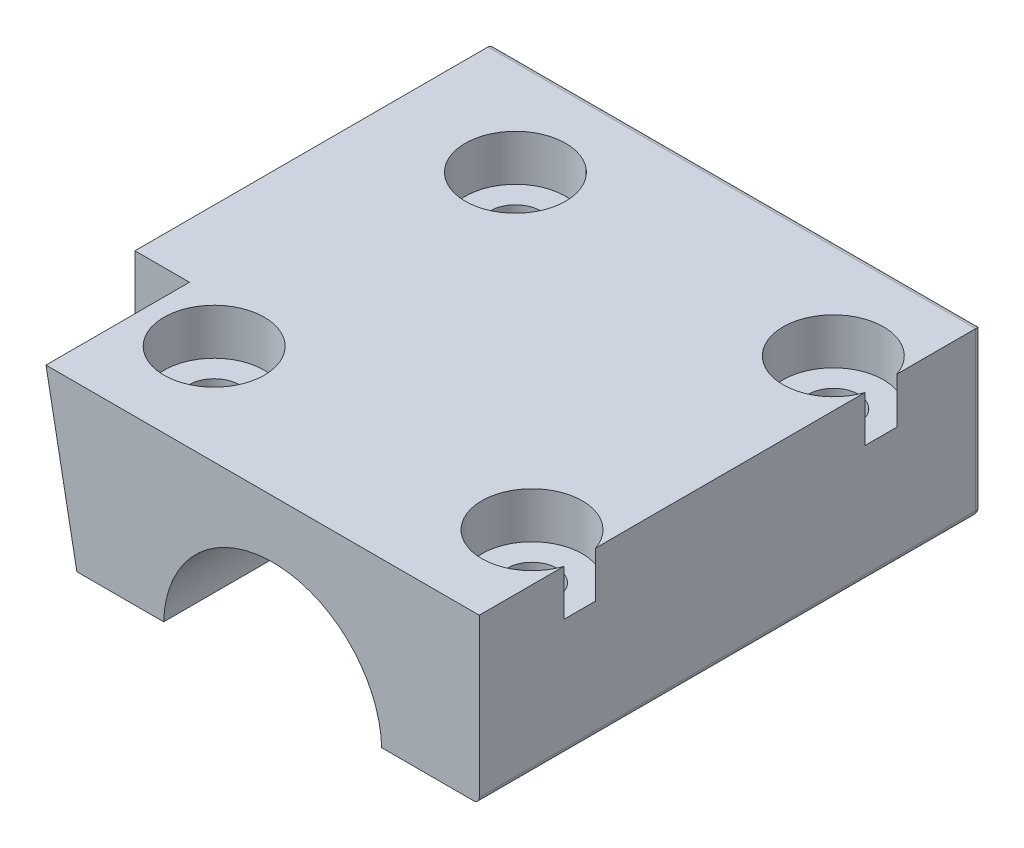
ISO-10303-21;
HEADER;
FILE_DESCRIPTION(('STEP AP214'),'2;1');
FILE_NAME('part.step','',(''),(''),'','','');
FILE_SCHEMA(('AUTOMOTIVE_DESIGN { 1 0 10303 214 1 1 1 1 }'));
ENDSEC;
DATA;
#1=APPLICATION_CONTEXT('core data for automotive mechanical design processes');
#2=APPLICATION_PROTOCOL_DEFINITION('international standard','automotive_design',2000,#1);
#3=PRODUCT_CONTEXT('',#1,'mechanical');
#4=PRODUCT('Part','Part','',(#3));
#5=PRODUCT_RELATED_PRODUCT_CATEGORY('part','',(#4));
#6=PRODUCT_DEFINITION_FORMATION('','',#4);
#7=PRODUCT_DEFINITION_CONTEXT('part definition',#1,'design');
#8=PRODUCT_DEFINITION('design','',#6,#7);
#9=PRODUCT_DEFINITION_SHAPE('','',#8);
#10=(LENGTH_UNIT() NAMED_UNIT(*) SI_UNIT(.MILLI.,.METRE.));
#11=(NAMED_UNIT(*) PLANE_ANGLE_UNIT() SI_UNIT($,.RADIAN.));
#12=(NAMED_UNIT(*) SI_UNIT($,.STERADIAN.) SOLID_ANGLE_UNIT());
#13=UNCERTAINTY_MEASURE_WITH_UNIT(LENGTH_MEASURE(1.E-05),#10,'distance_accuracy_value','');
#14=(GEOMETRIC_REPRESENTATION_CONTEXT(3) GLOBAL_UNCERTAINTY_ASSIGNED_CONTEXT((#13)) GLOBAL_UNIT_ASSIGNED_CONTEXT((#10,
#11,#12)) REPRESENTATION_CONTEXT('',''));
#15=CARTESIAN_POINT('',(0.,0.,0.));
#16=DIRECTION('',(0.,0.,1.));
#17=DIRECTION('',(1.,0.,0.));
#18=AXIS2_PLACEMENT_3D('',#15,#16,#17);
#19=CARTESIAN_POINT('',(82.6500040000003,-20.05,-34.9999999999992));
#20=DIRECTION('',(0.,1.,0.));
#21=DIRECTION('',(1.,0.,0.));
#22=AXIS2_PLACEMENT_3D('',#19,#20,#21);
#23=PLANE('',#22);
#24=CARTESIAN_POINT('',(91.1714091434301,-20.05,-41.9999999999988));
#25=DIRECTION('',(0.,-1.,0.));
#26=DIRECTION('',(-1.,0.,0.));
#27=AXIS2_PLACEMENT_3D('',#24,#25,#26);
#28=CIRCLE('',#27,3.5);
#29=CARTESIAN_POINT('',(94.67140914343,-20.0499999999997,-41.9999999999986));
#30=VERTEX_POINT('',#29);
#31=EDGE_CURVE('E21',#30,#30,#28,.T.);
#32=ORIENTED_EDGE('',*,*,#31,.T.);
#33=EDGE_LOOP('',(#32));
#34=FACE_BOUND('',#33,.T.);
#35=CARTESIAN_POINT('',(91.1714091434314,-20.05,-62.9999999999991));
#36=DIRECTION('',(0.,-1.,0.));
#37=DIRECTION('',(-1.,0.,0.));
#38=AXIS2_PLACEMENT_3D('',#35,#36,#37);
#39=CIRCLE('',#38,3.5);
#40=CARTESIAN_POINT('',(94.6714091434314,-20.0499999999997,-62.9999999999989));
#41=VERTEX_POINT('',#40);
#42=EDGE_CURVE('E370',#41,#41,#39,.T.);
#43=ORIENTED_EDGE('',*,*,#42,.T.);
#44=EDGE_LOOP('',(#43));
#45=FACE_BOUND('',#44,.T.);
#46=DIRECTION('',(0.,0.,1.));
#47=VECTOR('',#46,1.);
#48=CARTESIAN_POINT('',(86.4500040000002,-20.05,-34.999999999999));
#49=LINE('',#48,#47);
#50=CARTESIAN_POINT('',(86.4500040000001,-20.05,-44.9999999999987));
#51=VERTEX_POINT('',#50);
#52=CARTESIAN_POINT('',(86.4500040000002,-20.05,-34.9999999999987));
#53=VERTEX_POINT('',#52);
#54=EDGE_CURVE('E312',#51,#53,#49,.T.);
#55=ORIENTED_EDGE('',*,*,#54,.T.);
#56=DIRECTION('',(-1.,0.,0.));
#57=VECTOR('',#56,1.);
#58=CARTESIAN_POINT('',(116.65,-20.05,-34.9999999999995));
#59=LINE('',#58,#57);
#60=CARTESIAN_POINT('',(116.65,-20.05,-34.9999999999995));
#61=VERTEX_POINT('',#60);
#62=EDGE_CURVE('E348',#61,#53,#59,.T.);
#63=ORIENTED_EDGE('',*,*,#62,.F.);
#64=DIRECTION('',(0.,0.,-1.));
#65=VECTOR('',#64,1.);
#66=CARTESIAN_POINT('',(116.65,-20.05,-34.9999999999995));
#67=LINE('',#66,#65);
#68=CARTESIAN_POINT('',(116.65,-20.0499999999997,-40.8962362370529));
#69=VERTEX_POINT('',#68);
#70=EDGE_CURVE('E257',#61,#69,#67,.T.);
#71=ORIENTED_EDGE('',*,*,#70,.T.);
#72=CARTESIAN_POINT('',(113.328598856566,-20.05,-42.0000000000011));
#73=DIRECTION('',(0.,-1.,0.));
#74=DIRECTION('',(-1.,0.,0.));
#75=AXIS2_PLACEMENT_3D('',#72,#73,#74);
#76=CIRCLE('',#75,3.5);
#77=CARTESIAN_POINT('',(116.65,-20.0499999999997,-43.1037637629495));
#78=VERTEX_POINT('',#77);
#79=EDGE_CURVE('E208',#69,#78,#76,.T.);
#80=ORIENTED_EDGE('',*,*,#79,.T.);
#81=DIRECTION('',(0.,0.,-1.));
#82=VECTOR('',#81,1.);
#83=CARTESIAN_POINT('',(116.65,-20.05,-34.9999999999995));
#84=LINE('',#83,#82);
#85=CARTESIAN_POINT('',(116.65,-20.0499999999997,-61.896236237051));
#86=VERTEX_POINT('',#85);
#87=EDGE_CURVE('E380',#78,#86,#84,.T.);
#88=ORIENTED_EDGE('',*,*,#87,.T.);
#89=CARTESIAN_POINT('',(113.328598856566,-20.05,-63.));
#90=DIRECTION('',(0.,-1.,0.));
#91=DIRECTION('',(-1.,0.,0.));
#92=AXIS2_PLACEMENT_3D('',#89,#90,#91);
#93=CIRCLE('',#92,3.5);
#94=CARTESIAN_POINT('',(116.65,-20.0499999999997,-64.1037637629477));
#95=VERTEX_POINT('',#94);
#96=EDGE_CURVE('E219',#86,#95,#93,.T.);
#97=ORIENTED_EDGE('',*,*,#96,.T.);
#98=DIRECTION('',(0.,0.,-1.));
#99=VECTOR('',#98,1.);
#100=CARTESIAN_POINT('',(116.65,-20.05,-34.9999999999995));
#101=LINE('',#100,#99);
#102=CARTESIAN_POINT('',(116.65,-20.05,-69.6));
#103=VERTEX_POINT('',#102);
#104=EDGE_CURVE('E267',#95,#103,#101,.T.);
#105=ORIENTED_EDGE('',*,*,#104,.T.);
#106=DIRECTION('',(1.,0.,0.));
#107=VECTOR('',#106,1.);
#108=CARTESIAN_POINT('',(91.1500029999999,-20.05,-69.6));
#109=LINE('',#108,#107);
#110=CARTESIAN_POINT('',(82.650004,-20.05,-69.6));
#111=VERTEX_POINT('',#110);
#112=EDGE_CURVE('E280',#111,#103,#109,.T.);
#113=ORIENTED_EDGE('',*,*,#112,.F.);
#114=DIRECTION('',(0.,0.,-1.));
#115=VECTOR('',#114,1.);
#116=CARTESIAN_POINT('',(82.6500040000003,-20.05,-34.9999999999992));
#117=LINE('',#116,#115);
#118=CARTESIAN_POINT('',(82.6500040000001,-20.05,-44.9999999999987));
#119=VERTEX_POINT('',#118);
#120=EDGE_CURVE('E11',#119,#111,#117,.T.);
#121=ORIENTED_EDGE('',*,*,#120,.F.);
#122=DIRECTION('',(1.,0.,0.));
#123=VECTOR('',#122,1.);
#124=CARTESIAN_POINT('',(91.1500030000001,-20.05,-44.9999999903469));
#125=LINE('',#124,#123);
#126=EDGE_CURVE('E315',#119,#51,#125,.T.);
#127=ORIENTED_EDGE('',*,*,#126,.T.);
#128=EDGE_LOOP('',(#55,#63,#71,#80,#88,#97,#105,#113,#121,#127));
#129=FACE_BOUND('',#128,.T.);
#130=ADVANCED_FACE('F17',(#34,#45,#129),#23,.T.);
#131=CARTESIAN_POINT('',(82.6500040000003,-31.6499999999994,-34.9999999999993));
#132=DIRECTION('',(-1.,0.,0.));
#133=DIRECTION('',(0.,1.,0.));
#134=AXIS2_PLACEMENT_3D('',#131,#132,#133);
#135=PLANE('',#134);
#136=DIRECTION('',(0.,1.,0.));
#137=VECTOR('',#136,1.);
#138=CARTESIAN_POINT('',(82.6500040000002,-28.6999999999995,-44.9999999903468));
#139=LINE('',#138,#137);
#140=CARTESIAN_POINT('',(82.6500040000001,-31.0499999999994,-44.9999999999987));
#141=VERTEX_POINT('',#140);
#142=EDGE_CURVE('E273',#141,#119,#139,.T.);
#143=ORIENTED_EDGE('',*,*,#142,.T.);
#144=ORIENTED_EDGE('',*,*,#120,.T.);
#145=DIRECTION('',(0.,1.,0.));
#146=VECTOR('',#145,1.);
#147=CARTESIAN_POINT('',(82.650004,-28.7499999999995,-69.6));
#148=LINE('',#147,#146);
#149=CARTESIAN_POINT('',(82.650004,-31.0499999999994,-69.6));
#150=VERTEX_POINT('',#149);
#151=EDGE_CURVE('E28',#150,#111,#148,.T.);
#152=ORIENTED_EDGE('',*,*,#151,.F.);
#153=DIRECTION('',(0.,0.,-1.));
#154=VECTOR('',#153,1.);
#155=CARTESIAN_POINT('',(82.6500040000003,-31.0499999999994,-34.9999999999993));
#156=LINE('',#155,#154);
#157=EDGE_CURVE('E335',#141,#150,#156,.T.);
#158=ORIENTED_EDGE('',*,*,#157,.F.);
#159=EDGE_LOOP('',(#143,#144,#152,#158));
#160=FACE_BOUND('',#159,.T.);
#161=ADVANCED_FACE('F1078',(#160),#135,.T.);
#162=CARTESIAN_POINT('',(102.250003999999,-31.6499999999994,-34.9999999999994));
#163=DIRECTION('',(0.,0.,-1.));
#164=DIRECTION('',(-1.,0.,0.));
#165=AXIS2_PLACEMENT_3D('',#162,#163,#164);
#166=CYLINDRICAL_SURFACE('',#165,7.6);
#167=CARTESIAN_POINT('',(102.250003999998,-31.6499999999994,-69.6));
#168=DIRECTION('',(0.,0.,1.));
#169=DIRECTION('',(0.,1.,0.));
#170=AXIS2_PLACEMENT_3D('',#167,#168,#169);
#171=CIRCLE('',#170,7.6);
#172=CARTESIAN_POINT('',(109.847371965287,-31.4499999999994,-69.6));
#173=VERTEX_POINT('',#172);
#174=CARTESIAN_POINT('',(94.6526360347093,-31.4499999999994,-69.6));
#175=VERTEX_POINT('',#174);
#176=EDGE_CURVE('E361',#173,#175,#171,.T.);
#177=ORIENTED_EDGE('',*,*,#176,.F.);
#178=DIRECTION('',(0.,0.,1.));
#179=VECTOR('',#178,1.);
#180=CARTESIAN_POINT('',(109.847371965288,-31.4499999999994,-34.9999999999994));
#181=LINE('',#180,#179);
#182=CARTESIAN_POINT('',(109.847371965288,-31.4499999999994,-34.9999999999995));
#183=VERTEX_POINT('',#182);
#184=EDGE_CURVE('E300',#173,#183,#181,.T.);
#185=ORIENTED_EDGE('',*,*,#184,.T.);
#186=CARTESIAN_POINT('',(102.250003999999,-31.6499999999994,-34.9999999999994));
#187=DIRECTION('',(0.,0.,1.));
#188=DIRECTION('',(-1.,0.,0.));
#189=AXIS2_PLACEMENT_3D('',#186,#187,#188);
#190=CIRCLE('',#189,7.6);
#191=CARTESIAN_POINT('',(94.6526360347096,-31.4499999999994,-34.9999999999993));
#192=VERTEX_POINT('',#191);
#193=EDGE_CURVE('E225',#183,#192,#190,.T.);
#194=ORIENTED_EDGE('',*,*,#193,.T.);
#195=DIRECTION('',(0.,0.,-1.));
#196=VECTOR('',#195,1.);
#197=CARTESIAN_POINT('',(94.6526360347096,-31.4499999999994,-34.9999999999994));
#198=LINE('',#197,#196);
#199=EDGE_CURVE('E246',#192,#175,#198,.T.);
#200=ORIENTED_EDGE('',*,*,#199,.T.);
#201=EDGE_LOOP('',(#177,#185,#194,#200));
#202=FACE_BOUND('',#201,.T.);
#203=ADVANCED_FACE('F560',(#202),#166,.F.);
#204=CARTESIAN_POINT('',(83.050004,-28.7499999999995,-69.6));
#205=DIRECTION('',(0.,-1.,0.));
#206=DIRECTION('',(-0.707106781186579,0.,-0.707106781186516));
#207=AXIS2_PLACEMENT_3D('',#204,#205,#206);
#208=CYLINDRICAL_SURFACE('',#207,0.4);
#209=CARTESIAN_POINT('',(83.050004,-31.0499999999994,-69.6));
#210=DIRECTION('',(0.,-1.,0.));
#211=DIRECTION('',(-0.707106781186581,0.,-0.707106781186514));
#212=AXIS2_PLACEMENT_3D('',#209,#210,#211);
#213=CIRCLE('',#212,0.399999999999995);
#214=CARTESIAN_POINT('',(83.050004,-31.0499999999994,-70.));
#215=VERTEX_POINT('',#214);
#216=EDGE_CURVE('E226',#150,#215,#213,.T.);
#217=ORIENTED_EDGE('',*,*,#216,.F.);
#218=ORIENTED_EDGE('',*,*,#151,.T.);
#219=CARTESIAN_POINT('',(83.050004,-20.45,-69.6));
#220=DIRECTION('',(0.70710678118654,0.707106781186555,0.));
#221=DIRECTION('',(0.707106781186555,-0.70710678118654,0.));
#222=AXIS2_PLACEMENT_3D('',#219,#220,#221);
#223=ELLIPSE('',#222,0.565685424949244,0.4);
#224=CARTESIAN_POINT('',(83.050004,-20.45,-70.));
#225=VERTEX_POINT('',#224);
#226=EDGE_CURVE('E294',#225,#111,#223,.T.);
#227=ORIENTED_EDGE('',*,*,#226,.F.);
#228=DIRECTION('',(0.,-1.,0.));
#229=VECTOR('',#228,1.);
#230=CARTESIAN_POINT('',(83.050004,-28.7499999999995,-70.));
#231=LINE('',#230,#229);
#232=EDGE_CURVE('E295',#225,#215,#231,.T.);
#233=ORIENTED_EDGE('',*,*,#232,.T.);
#234=EDGE_LOOP('',(#217,#218,#227,#233));
#235=FACE_BOUND('',#234,.T.);
#236=ADVANCED_FACE('F1060',(#235),#208,.T.);
#237=CARTESIAN_POINT('',(91.1500029999999,-20.45,-69.6));
#238=DIRECTION('',(-1.,0.,0.));
#239=DIRECTION('',(0.,0.707106781186555,-0.70710678118654));
#240=AXIS2_PLACEMENT_3D('',#237,#238,#239);
#241=CYLINDRICAL_SURFACE('',#240,0.4);
#242=DIRECTION('',(-1.,0.,0.));
#243=VECTOR('',#242,1.);
#244=CARTESIAN_POINT('',(91.1500029999999,-20.45,-70.));
#245=LINE('',#244,#243);
#246=CARTESIAN_POINT('',(116.25,-20.45,-70.));
#247=VERTEX_POINT('',#246);
#248=EDGE_CURVE('E291',#247,#225,#245,.T.);
#249=ORIENTED_EDGE('',*,*,#248,.T.);
#250=ORIENTED_EDGE('',*,*,#226,.T.);
#251=ORIENTED_EDGE('',*,*,#112,.T.);
#252=CARTESIAN_POINT('',(116.25,-20.45,-69.6));
#253=DIRECTION('',(0.707106781186571,-0.707106781186524,0.));
#254=DIRECTION('',(-0.707106781186524,-0.707106781186571,0.));
#255=AXIS2_PLACEMENT_3D('',#252,#253,#254);
#256=ELLIPSE('',#255,0.565685424949257,0.4);
#257=EDGE_CURVE('E431',#247,#103,#256,.T.);
#258=ORIENTED_EDGE('',*,*,#257,.F.);
#259=EDGE_LOOP('',(#249,#250,#251,#258));
#260=FACE_BOUND('',#259,.T.);
#261=ADVANCED_FACE('F573',(#260),#241,.T.);
#262=CARTESIAN_POINT('',(99.6500019999999,-25.85,-70.));
#263=DIRECTION('',(0.,0.,-1.));
#264=DIRECTION('',(-1.,0.,0.));
#265=AXIS2_PLACEMENT_3D('',#262,#263,#264);
#266=PLANE('',#265);
#267=DIRECTION('',(1.,0.,0.));
#268=VECTOR('',#267,1.);
#269=CARTESIAN_POINT('',(108.150001,-31.0499999999994,-70.));
#270=LINE('',#269,#268);
#271=CARTESIAN_POINT('',(110.22747227007,-31.0499999999994,-70.));
#272=VERTEX_POINT('',#271);
#273=CARTESIAN_POINT('',(116.25,-31.0499999999994,-70.));
#274=VERTEX_POINT('',#273);
#275=EDGE_CURVE('E248',#272,#274,#270,.T.);
#276=ORIENTED_EDGE('',*,*,#275,.F.);
#277=CARTESIAN_POINT('',(102.250003999998,-31.6499999999994,-70.));
#278=DIRECTION('',(0.,0.,-1.));
#279=DIRECTION('',(0.,1.,0.));
#280=AXIS2_PLACEMENT_3D('',#277,#278,#279);
#281=CIRCLE('',#280,8.);
#282=CARTESIAN_POINT('',(94.2725357299267,-31.0499999999994,-70.));
#283=VERTEX_POINT('',#282);
#284=EDGE_CURVE('E343',#283,#272,#281,.T.);
#285=ORIENTED_EDGE('',*,*,#284,.F.);
#286=DIRECTION('',(1.,0.,0.));
#287=VECTOR('',#286,1.);
#288=CARTESIAN_POINT('',(97.1500029999991,-31.0499999999994,-70.));
#289=LINE('',#288,#287);
#290=EDGE_CURVE('E394',#215,#283,#289,.T.);
#291=ORIENTED_EDGE('',*,*,#290,.F.);
#292=ORIENTED_EDGE('',*,*,#232,.F.);
#293=ORIENTED_EDGE('',*,*,#248,.F.);
#294=DIRECTION('',(0.,1.,0.));
#295=VECTOR('',#294,1.);
#296=CARTESIAN_POINT('',(116.25,-22.95,-70.));
#297=LINE('',#296,#295);
#298=EDGE_CURVE('E303',#274,#247,#297,.T.);
#299=ORIENTED_EDGE('',*,*,#298,.F.);
#300=EDGE_LOOP('',(#276,#285,#291,#292,#293,#299));
#301=FACE_BOUND('',#300,.T.);
#302=ADVANCED_FACE('F568',(#301),#266,.T.);
#303=CARTESIAN_POINT('',(116.25,-22.95,-69.6));
#304=DIRECTION('',(0.,1.,0.));
#305=DIRECTION('',(0.707106781186516,0.,-0.707106781186579));
#306=AXIS2_PLACEMENT_3D('',#303,#304,#305);
#307=CYLINDRICAL_SURFACE('',#306,0.4);
#308=CARTESIAN_POINT('',(116.25,-31.0499999999994,-69.6));
#309=DIRECTION('',(0.,-1.,0.));
#310=DIRECTION('',(0.707106781186525,0.,-0.70710678118657));
#311=AXIS2_PLACEMENT_3D('',#308,#309,#310);
#312=CIRCLE('',#311,0.4);
#313=CARTESIAN_POINT('',(116.65,-31.0499999999994,-69.6));
#314=VERTEX_POINT('',#313);
#315=EDGE_CURVE('E230',#274,#314,#312,.T.);
#316=ORIENTED_EDGE('',*,*,#315,.F.);
#317=ORIENTED_EDGE('',*,*,#298,.T.);
#318=ORIENTED_EDGE('',*,*,#257,.T.);
#319=DIRECTION('',(0.,-1.,0.));
#320=VECTOR('',#319,1.);
#321=CARTESIAN_POINT('',(116.65,-22.95,-69.6));
#322=LINE('',#321,#320);
#323=EDGE_CURVE('E263',#103,#314,#322,.T.);
#324=ORIENTED_EDGE('',*,*,#323,.T.);
#325=EDGE_LOOP('',(#316,#317,#318,#324));
#326=FACE_BOUND('',#325,.T.);
#327=ADVANCED_FACE('F429',(#326),#307,.T.);
#328=CARTESIAN_POINT('',(116.65,-31.4499999999994,-34.9999999999995));
#329=DIRECTION('',(0.,1.,0.));
#330=DIRECTION('',(0.,0.,-1.));
#331=AXIS2_PLACEMENT_3D('',#328,#329,#330);
#332=PLANE('',#331);
#333=CARTESIAN_POINT('',(113.328598856566,-31.4499999999994,-63.));
#334=DIRECTION('',(0.,1.,0.));
#335=DIRECTION('',(-1.,0.,0.));
#336=AXIS2_PLACEMENT_3D('',#333,#334,#335);
#337=CIRCLE('',#336,1.75);
#338=CARTESIAN_POINT('',(115.078598856566,-31.4499999999991,-62.9999999999993));
#339=VERTEX_POINT('',#338);
#340=EDGE_CURVE('E237',#339,#339,#337,.T.);
#341=ORIENTED_EDGE('',*,*,#340,.T.);
#342=EDGE_LOOP('',(#341));
#343=FACE_BOUND('',#342,.T.);
#344=CARTESIAN_POINT('',(113.328598856566,-31.4499999999994,-42.0000000000011));
#345=DIRECTION('',(0.,1.,0.));
#346=DIRECTION('',(-1.,0.,0.));
#347=AXIS2_PLACEMENT_3D('',#344,#345,#346);
#348=CIRCLE('',#347,1.75);
#349=CARTESIAN_POINT('',(115.078598856566,-31.4499999999991,-42.000000000001));
#350=VERTEX_POINT('',#349);
#351=EDGE_CURVE('E356',#350,#350,#348,.T.);
#352=ORIENTED_EDGE('',*,*,#351,.T.);
#353=EDGE_LOOP('',(#352));
#354=FACE_BOUND('',#353,.T.);
#355=DIRECTION('',(-1.,0.,0.));
#356=VECTOR('',#355,1.);
#357=CARTESIAN_POINT('',(108.150001,-31.4499999999994,-69.6));
#358=LINE('',#357,#356);
#359=CARTESIAN_POINT('',(116.25,-31.4499999999994,-69.6));
#360=VERTEX_POINT('',#359);
#361=EDGE_CURVE('E231',#360,#173,#358,.T.);
#362=ORIENTED_EDGE('',*,*,#361,.F.);
#363=DIRECTION('',(0.,0.,-1.));
#364=VECTOR('',#363,1.);
#365=CARTESIAN_POINT('',(116.25,-31.4499999999994,-34.9999999999995));
#366=LINE('',#365,#364);
#367=CARTESIAN_POINT('',(116.25,-31.4499999999994,-34.9999999903476));
#368=VERTEX_POINT('',#367);
#369=EDGE_CURVE('E240',#368,#360,#366,.T.);
#370=ORIENTED_EDGE('',*,*,#369,.F.);
#371=DIRECTION('',(1.,0.,0.));
#372=VECTOR('',#371,1.);
#373=CARTESIAN_POINT('',(108.150001,-31.4499999999994,-34.9999999903475));
#374=LINE('',#373,#372);
#375=EDGE_CURVE('E220',#183,#368,#374,.T.);
#376=ORIENTED_EDGE('',*,*,#375,.F.);
#377=ORIENTED_EDGE('',*,*,#184,.F.);
#378=EDGE_LOOP('',(#362,#370,#376,#377));
#379=FACE_BOUND('',#378,.T.);
#380=ADVANCED_FACE('F563',(#343,#354,#379),#332,.F.);
#381=CARTESIAN_POINT('',(116.25,-31.0499999999994,-69.6));
#382=DIRECTION('',(-0.40824829046386,-0.816496580927711,0.408248290463896));
#383=DIRECTION('',(0.577350269189581,-0.577350269189644,-0.577350269189653));
#384=AXIS2_PLACEMENT_3D('',#381,#382,#383);
#385=SPHERICAL_SURFACE('',#384,0.4);
#386=CARTESIAN_POINT('',(116.25,-31.0499999999994,-69.6));
#387=DIRECTION('',(-1.,0.,0.));
#388=DIRECTION('',(0.,0.,-1.));
#389=AXIS2_PLACEMENT_3D('',#386,#387,#388);
#390=CIRCLE('',#389,0.4);
#391=EDGE_CURVE('E252',#274,#360,#390,.T.);
#392=ORIENTED_EDGE('',*,*,#391,.F.);
#393=ORIENTED_EDGE('',*,*,#315,.T.);
#394=CARTESIAN_POINT('',(116.25,-31.0499999999994,-69.6));
#395=DIRECTION('',(0.,0.,1.));
#396=DIRECTION('',(0.,-1.,0.));
#397=AXIS2_PLACEMENT_3D('',#394,#395,#396);
#398=CIRCLE('',#397,0.4);
#399=EDGE_CURVE('E277',#360,#314,#398,.T.);
#400=ORIENTED_EDGE('',*,*,#399,.F.);
#401=EDGE_LOOP('',(#392,#393,#400));
#402=FACE_BOUND('',#401,.T.);
#403=ADVANCED_FACE('F415',(#402),#385,.T.);
#404=CARTESIAN_POINT('',(83.050004,-31.0499999999994,-69.6));
#405=DIRECTION('',(0.40824829046386,-0.816496580927729,0.40824829046386));
#406=DIRECTION('',(-0.577350269189629,-0.57735026918962,-0.577350269189629));
#407=AXIS2_PLACEMENT_3D('',#404,#405,#406);
#408=SPHERICAL_SURFACE('',#407,0.4);
#409=CARTESIAN_POINT('',(83.050004,-31.0499999999994,-69.6));
#410=DIRECTION('',(0.,0.,1.));
#411=DIRECTION('',(-1.,0.,0.));
#412=AXIS2_PLACEMENT_3D('',#409,#410,#411);
#413=CIRCLE('',#412,0.399999999999991);
#414=CARTESIAN_POINT('',(83.050004,-31.4499999999994,-69.6));
#415=VERTEX_POINT('',#414);
#416=EDGE_CURVE('E215',#150,#415,#413,.T.);
#417=ORIENTED_EDGE('',*,*,#416,.F.);
#418=ORIENTED_EDGE('',*,*,#216,.T.);
#419=CARTESIAN_POINT('',(83.050004,-31.0499999999994,-69.6));
#420=DIRECTION('',(1.,0.,0.));
#421=DIRECTION('',(0.,-1.,0.));
#422=AXIS2_PLACEMENT_3D('',#419,#420,#421);
#423=CIRCLE('',#422,0.4);
#424=EDGE_CURVE('E399',#415,#215,#423,.T.);
#425=ORIENTED_EDGE('',*,*,#424,.F.);
#426=EDGE_LOOP('',(#417,#418,#425));
#427=FACE_BOUND('',#426,.T.);
#428=ADVANCED_FACE('F1009',(#427),#408,.T.);
#429=CARTESIAN_POINT('',(108.150001,-31.0499999999994,-69.6));
#430=DIRECTION('',(-1.,0.,0.));
#431=DIRECTION('',(0.,-0.707106781186555,-0.70710678118654));
#432=AXIS2_PLACEMENT_3D('',#429,#430,#431);
#433=CYLINDRICAL_SURFACE('',#432,0.4);
#434=ORIENTED_EDGE('',*,*,#275,.T.);
#435=ORIENTED_EDGE('',*,*,#391,.T.);
#436=ORIENTED_EDGE('',*,*,#361,.T.);
#437=CARTESIAN_POINT('',(110.22747227007,-31.0499999999994,-70.));
#438=CARTESIAN_POINT('',(110.226601420561,-31.0509388073405,-70.));
#439=CARTESIAN_POINT('',(110.225730492149,-31.0518775460167,-69.9999966949025));
#440=CARTESIAN_POINT('',(110.186441089357,-31.0942190743765,-69.9996985821304));
#441=CARTESIAN_POINT('',(110.14769249029,-31.1356710607235,-69.9929781492694));
#442=CARTESIAN_POINT('',(110.073843441673,-31.2141114194625,-69.9670291712444));
#443=CARTESIAN_POINT('',(110.038249566349,-31.2516437189782,-69.9481223999647));
#444=CARTESIAN_POINT('',(109.970045004078,-31.3231215382995,-69.8957756063477));
#445=CARTESIAN_POINT('',(109.93729079676,-31.3571850338028,-69.8611634445186));
#446=CARTESIAN_POINT('',(109.890291432908,-31.4058389896266,-69.7866677210535));
#447=CARTESIAN_POINT('',(109.873589297114,-31.4230454103313,-69.7502666560382));
#448=CARTESIAN_POINT('',(109.852612821012,-31.4446240003891,-69.6749219872075));
#449=CARTESIAN_POINT('',(109.847371965287,-31.4499999999994,-69.6378879838991));
#450=CARTESIAN_POINT('',(109.847371965287,-31.4499999999994,-69.6));
#451=(BOUNDED_CURVE() B_SPLINE_CURVE(3,(#437,#438,#439,#440,#441,#442,#443,#444,#445,#446,#447,
#448,#449,#450),.UNSPECIFIED.,.F.,.F.) B_SPLINE_CURVE_WITH_KNOTS((4,2,2,2,2,2,4),
(-0.000384156775502614,0.,0.0169447092003417,0.0332638025637713,0.050564555527263,
0.0636348109178755,0.0751010817365113),
.UNSPECIFIED.) CURVE() GEOMETRIC_REPRESENTATION_ITEM() RATIONAL_B_SPLINE_CURVE((1.,1.,1.,1.,1.,
1.,1.,1.,1.,1.,1.,1.,1.,1.)) REPRESENTATION_ITEM(''));
#452=EDGE_CURVE('E253',#272,#173,#451,.T.);
#453=ORIENTED_EDGE('',*,*,#452,.F.);
#454=EDGE_LOOP('',(#434,#435,#436,#453));
#455=FACE_BOUND('',#454,.T.);
#456=ADVANCED_FACE('F566',(#455),#433,.T.);
#457=CARTESIAN_POINT('',(102.250003999998,-31.6499999999994,-69.6));
#458=DIRECTION('',(0.,0.,-1.));
#459=DIRECTION('',(-1.,0.,0.));
#460=AXIS2_PLACEMENT_3D('',#457,#458,#459);
#461=TOROIDAL_SURFACE('',#460,8.,0.4);
#462=ORIENTED_EDGE('',*,*,#176,.T.);
#463=CARTESIAN_POINT('',(94.2725357299267,-31.0499999999994,-70.));
#464=CARTESIAN_POINT('',(94.2734065794355,-31.0509388073405,-70.));
#465=CARTESIAN_POINT('',(94.274277507848,-31.0518775460168,-69.9999966949024));
#466=CARTESIAN_POINT('',(94.3135669106385,-31.0942190743758,-69.9996985821303));
#467=CARTESIAN_POINT('',(94.3523155097064,-31.1356710607233,-69.9929781492693));
#468=CARTESIAN_POINT('',(94.426164558324,-31.2141114194625,-69.9670291712443));
#469=CARTESIAN_POINT('',(94.4617584336482,-31.2516437189782,-69.9481223999646));
#470=CARTESIAN_POINT('',(94.5299629959184,-31.3231215382994,-69.8957756063476));
#471=CARTESIAN_POINT('',(94.5627172032367,-31.3571850338028,-69.8611634445185));
#472=CARTESIAN_POINT('',(94.6097165670887,-31.4058389896266,-69.7866677210534));
#473=CARTESIAN_POINT('',(94.6264187028825,-31.4230454103313,-69.7502666560381));
#474=CARTESIAN_POINT('',(94.6473951789847,-31.444624000389,-69.6749219872075));
#475=CARTESIAN_POINT('',(94.6526360347093,-31.4499999999994,-69.637887983899));
#476=CARTESIAN_POINT('',(94.6526360347093,-31.4499999999994,-69.6));
#477=(BOUNDED_CURVE() B_SPLINE_CURVE(3,(#463,#464,#465,#466,#467,#468,#469,#470,#471,#472,#473,
#474,#475,#476),.UNSPECIFIED.,.F.,.F.) B_SPLINE_CURVE_WITH_KNOTS((4,2,2,2,2,2,4),
(-0.0748277329214132,-0.0744469222998409,-0.0576498080630513,-0.0414728603075902,
-0.024322803586457,-0.0113663951698894,0.),
.UNSPECIFIED.) CURVE() GEOMETRIC_REPRESENTATION_ITEM() RATIONAL_B_SPLINE_CURVE((1.,1.,1.,1.,1.,
1.,1.,1.,1.,1.,1.,1.,1.,1.)) REPRESENTATION_ITEM(''));
#478=EDGE_CURVE('E398',#283,#175,#477,.T.);
#479=ORIENTED_EDGE('',*,*,#478,.F.);
#480=ORIENTED_EDGE('',*,*,#284,.T.);
#481=ORIENTED_EDGE('',*,*,#452,.T.);
#482=EDGE_LOOP('',(#462,#479,#480,#481));
#483=FACE_BOUND('',#482,.T.);
#484=ADVANCED_FACE('F989',(#483),#461,.T.);
#485=CARTESIAN_POINT('',(97.1500029999991,-31.0499999999994,-69.6));
#486=DIRECTION('',(-1.,0.,0.));
#487=DIRECTION('',(0.,-0.707106781186555,-0.70710678118654));
#488=AXIS2_PLACEMENT_3D('',#485,#486,#487);
#489=CYLINDRICAL_SURFACE('',#488,0.4);
#490=DIRECTION('',(-1.,0.,0.));
#491=VECTOR('',#490,1.);
#492=CARTESIAN_POINT('',(97.1500029999991,-31.4499999999994,-69.6));
#493=LINE('',#492,#491);
#494=EDGE_CURVE('E242',#175,#415,#493,.T.);
#495=ORIENTED_EDGE('',*,*,#494,.T.);
#496=ORIENTED_EDGE('',*,*,#424,.T.);
#497=ORIENTED_EDGE('',*,*,#290,.T.);
#498=ORIENTED_EDGE('',*,*,#478,.T.);
#499=EDGE_LOOP('',(#495,#496,#497,#498));
#500=FACE_BOUND('',#499,.T.);
#501=ADVANCED_FACE('F979',(#500),#489,.T.);
#502=CARTESIAN_POINT('',(116.25,-31.0499999999994,-34.9999999999995));
#503=DIRECTION('',(0.,0.,-1.));
#504=DIRECTION('',(0.70710678118654,-0.707106781186555,0.));
#505=AXIS2_PLACEMENT_3D('',#502,#503,#504);
#506=CYLINDRICAL_SURFACE('',#505,0.4);
#507=CARTESIAN_POINT('',(116.25,-31.0499999999994,-34.9999999903476));
#508=DIRECTION('',(0.,0.,-1.));
#509=DIRECTION('',(0.70710678118654,-0.707106781186555,0.));
#510=AXIS2_PLACEMENT_3D('',#507,#508,#509);
#511=CIRCLE('',#510,0.4);
#512=CARTESIAN_POINT('',(116.65,-31.0499999999994,-34.9999999999995));
#513=VERTEX_POINT('',#512);
#514=EDGE_CURVE('E224',#513,#368,#511,.T.);
#515=ORIENTED_EDGE('',*,*,#514,.T.);
#516=ORIENTED_EDGE('',*,*,#369,.T.);
#517=ORIENTED_EDGE('',*,*,#399,.T.);
#518=DIRECTION('',(0.,0.,1.));
#519=VECTOR('',#518,1.);
#520=CARTESIAN_POINT('',(116.65,-31.0499999999994,-34.9999999999995));
#521=LINE('',#520,#519);
#522=EDGE_CURVE('E261',#314,#513,#521,.T.);
#523=ORIENTED_EDGE('',*,*,#522,.T.);
#524=EDGE_LOOP('',(#515,#516,#517,#523));
#525=FACE_BOUND('',#524,.T.);
#526=ADVANCED_FACE('F422',(#525),#506,.T.);
#527=CARTESIAN_POINT('',(113.328598856566,-20.0499999999997,-63.));
#528=DIRECTION('',(0.,-1.,0.));
#529=DIRECTION('',(-1.,0.,0.));
#530=AXIS2_PLACEMENT_3D('',#527,#528,#529);
#531=CYLINDRICAL_SURFACE('',#530,1.75);
#532=CARTESIAN_POINT('',(113.328598856566,-23.2499953703009,-63.));
#533=DIRECTION('',(0.,1.,0.));
#534=DIRECTION('',(-1.,0.,0.));
#535=AXIS2_PLACEMENT_3D('',#532,#533,#534);
#536=CIRCLE('',#535,1.75);
#537=CARTESIAN_POINT('',(115.078598856566,-23.2499999999997,-62.9999999999993));
#538=VERTEX_POINT('',#537);
#539=EDGE_CURVE('E262',#538,#538,#536,.T.);
#540=ORIENTED_EDGE('',*,*,#539,.T.);
#541=DIRECTION('',(0.,-1.,0.));
#542=VECTOR('',#541,1.);
#543=CARTESIAN_POINT('',(115.078598856566,-20.0499999999997,-62.9999999999993));
#544=LINE('',#543,#542);
#545=EDGE_CURVE('E241',#538,#339,#544,.T.);
#546=ORIENTED_EDGE('',*,*,#545,.T.);
#547=ORIENTED_EDGE('',*,*,#340,.F.);
#548=ORIENTED_EDGE('',*,*,#545,.F.);
#549=EDGE_LOOP('',(#540,#546,#547,#548));
#550=FACE_BOUND('',#549,.T.);
#551=ADVANCED_FACE('F960',(#550),#531,.F.);
#552=CARTESIAN_POINT('',(113.328598856566,-20.0499999999997,-42.0000000000011));
#553=DIRECTION('',(0.,-1.,0.));
#554=DIRECTION('',(-1.,0.,0.));
#555=AXIS2_PLACEMENT_3D('',#552,#553,#554);
#556=CYLINDRICAL_SURFACE('',#555,1.75);
#557=CARTESIAN_POINT('',(113.328598856566,-23.2499953703009,-42.0000000000011));
#558=DIRECTION('',(0.,1.,0.));
#559=DIRECTION('',(-1.,0.,0.));
#560=AXIS2_PLACEMENT_3D('',#557,#558,#559);
#561=CIRCLE('',#560,1.75);
#562=CARTESIAN_POINT('',(115.078598856566,-23.2499999999997,-42.000000000001));
#563=VERTEX_POINT('',#562);
#564=EDGE_CURVE('E199',#563,#563,#561,.T.);
#565=ORIENTED_EDGE('',*,*,#564,.T.);
#566=DIRECTION('',(0.,-1.,0.));
#567=VECTOR('',#566,1.);
#568=CARTESIAN_POINT('',(115.078598856566,-20.0499999999997,-42.000000000001));
#569=LINE('',#568,#567);
#570=EDGE_CURVE('E352',#563,#350,#569,.T.);
#571=ORIENTED_EDGE('',*,*,#570,.T.);
#572=ORIENTED_EDGE('',*,*,#351,.F.);
#573=ORIENTED_EDGE('',*,*,#570,.F.);
#574=EDGE_LOOP('',(#565,#571,#572,#573));
#575=FACE_BOUND('',#574,.T.);
#576=ADVANCED_FACE('F948',(#575),#556,.F.);
#577=CARTESIAN_POINT('',(91.1714091434314,-20.0499999999997,-62.9999999999991));
#578=DIRECTION('',(0.,-1.,0.));
#579=DIRECTION('',(-1.,0.,0.));
#580=AXIS2_PLACEMENT_3D('',#577,#578,#579);
#581=CYLINDRICAL_SURFACE('',#580,1.75);
#582=CARTESIAN_POINT('',(91.1714091434314,-23.2499953703009,-62.9999999999991));
#583=DIRECTION('',(0.,1.,0.));
#584=DIRECTION('',(-1.,0.,0.));
#585=AXIS2_PLACEMENT_3D('',#582,#583,#584);
#586=CIRCLE('',#585,1.75);
#587=CARTESIAN_POINT('',(92.9214091434314,-23.2499999999997,-62.999999999999));
#588=VERTEX_POINT('',#587);
#589=EDGE_CURVE('E284',#588,#588,#586,.T.);
#590=ORIENTED_EDGE('',*,*,#589,.T.);
#591=DIRECTION('',(0.,-1.,0.));
#592=VECTOR('',#591,1.);
#593=CARTESIAN_POINT('',(92.9214091434314,-20.0499999999997,-62.999999999999));
#594=LINE('',#593,#592);
#595=CARTESIAN_POINT('',(92.9214091434314,-31.4499999999991,-62.999999999999));
#596=VERTEX_POINT('',#595);
#597=EDGE_CURVE('E357',#588,#596,#594,.T.);
#598=ORIENTED_EDGE('',*,*,#597,.T.);
#599=CARTESIAN_POINT('',(91.1714091434314,-31.4499999999994,-62.9999999999991));
#600=DIRECTION('',(0.,1.,0.));
#601=DIRECTION('',(-1.,0.,0.));
#602=AXIS2_PLACEMENT_3D('',#599,#600,#601);
#603=CIRCLE('',#602,1.75);
#604=EDGE_CURVE('E307',#596,#596,#603,.T.);
#605=ORIENTED_EDGE('',*,*,#604,.F.);
#606=ORIENTED_EDGE('',*,*,#597,.F.);
#607=EDGE_LOOP('',(#590,#598,#605,#606));
#608=FACE_BOUND('',#607,.T.);
#609=ADVANCED_FACE('F936',(#608),#581,.F.);
#610=CARTESIAN_POINT('',(91.1714091434301,-20.0499999999997,-41.9999999999988));
#611=DIRECTION('',(0.,-1.,0.));
#612=DIRECTION('',(-1.,0.,0.));
#613=AXIS2_PLACEMENT_3D('',#610,#611,#612);
#614=CYLINDRICAL_SURFACE('',#613,1.75);
#615=CARTESIAN_POINT('',(91.1714091434301,-23.2499953703009,-41.9999999999988));
#616=DIRECTION('',(0.,1.,0.));
#617=DIRECTION('',(-1.,0.,0.));
#618=AXIS2_PLACEMENT_3D('',#615,#616,#617);
#619=CIRCLE('',#618,1.75);
#620=CARTESIAN_POINT('',(92.9214091434301,-23.2499999999997,-41.9999999999987));
#621=VERTEX_POINT('',#620);
#622=EDGE_CURVE('E400',#621,#621,#619,.T.);
#623=ORIENTED_EDGE('',*,*,#622,.T.);
#624=DIRECTION('',(0.,-1.,0.));
#625=VECTOR('',#624,1.);
#626=CARTESIAN_POINT('',(92.9214091434301,-20.0499999999997,-41.9999999999987));
#627=LINE('',#626,#625);
#628=CARTESIAN_POINT('',(92.9214091434301,-31.4499999999991,-41.9999999999987));
#629=VERTEX_POINT('',#628);
#630=EDGE_CURVE('E383',#621,#629,#627,.T.);
#631=ORIENTED_EDGE('',*,*,#630,.T.);
#632=CARTESIAN_POINT('',(91.1714091434301,-31.4499999999994,-41.9999999999988));
#633=DIRECTION('',(0.,1.,0.));
#634=DIRECTION('',(-1.,0.,0.));
#635=AXIS2_PLACEMENT_3D('',#632,#633,#634);
#636=CIRCLE('',#635,1.75);
#637=EDGE_CURVE('E328',#629,#629,#636,.T.);
#638=ORIENTED_EDGE('',*,*,#637,.F.);
#639=ORIENTED_EDGE('',*,*,#630,.F.);
#640=EDGE_LOOP('',(#623,#631,#638,#639));
#641=FACE_BOUND('',#640,.T.);
#642=ADVANCED_FACE('F926',(#641),#614,.F.);
#643=CARTESIAN_POINT('',(116.65,-20.05,-34.9999999999994));
#644=DIRECTION('',(1.,0.,0.));
#645=DIRECTION('',(0.,0.,-1.));
#646=AXIS2_PLACEMENT_3D('',#643,#644,#645);
#647=PLANE('',#646);
#648=DIRECTION('',(0.,-1.,0.));
#649=VECTOR('',#648,1.);
#650=CARTESIAN_POINT('',(116.65,-20.0499999999997,-43.1037637629492));
#651=LINE('',#650,#649);
#652=CARTESIAN_POINT('',(116.65,-23.2499999999997,-43.1037637629495));
#653=VERTEX_POINT('',#652);
#654=EDGE_CURVE('E195',#78,#653,#651,.T.);
#655=ORIENTED_EDGE('',*,*,#654,.T.);
#656=DIRECTION('',(0.,0.,1.));
#657=VECTOR('',#656,1.);
#658=CARTESIAN_POINT('',(116.65,-23.2499953703009,-43.6499999999995));
#659=LINE('',#658,#657);
#660=CARTESIAN_POINT('',(116.65,-23.2499999999997,-40.8962362370529));
#661=VERTEX_POINT('',#660);
#662=EDGE_CURVE('E188',#653,#661,#659,.T.);
#663=ORIENTED_EDGE('',*,*,#662,.T.);
#664=DIRECTION('',(0.,1.,0.));
#665=VECTOR('',#664,1.);
#666=CARTESIAN_POINT('',(116.65,-20.0499999999997,-40.8962362370531));
#667=LINE('',#666,#665);
#668=EDGE_CURVE('E192',#661,#69,#667,.T.);
#669=ORIENTED_EDGE('',*,*,#668,.T.);
#670=ORIENTED_EDGE('',*,*,#70,.F.);
#671=DIRECTION('',(0.,1.,0.));
#672=VECTOR('',#671,1.);
#673=CARTESIAN_POINT('',(116.65,-89.6,-34.9999999999995));
#674=LINE('',#673,#672);
#675=EDGE_CURVE('E351',#513,#61,#674,.T.);
#676=ORIENTED_EDGE('',*,*,#675,.F.);
#677=ORIENTED_EDGE('',*,*,#522,.F.);
#678=ORIENTED_EDGE('',*,*,#323,.F.);
#679=ORIENTED_EDGE('',*,*,#104,.F.);
#680=DIRECTION('',(0.,-1.,0.));
#681=VECTOR('',#680,1.);
#682=CARTESIAN_POINT('',(116.65,-20.0499999999997,-64.1037637629475));
#683=LINE('',#682,#681);
#684=CARTESIAN_POINT('',(116.65,-23.2499999999997,-64.1037637629477));
#685=VERTEX_POINT('',#684);
#686=EDGE_CURVE('E290',#95,#685,#683,.T.);
#687=ORIENTED_EDGE('',*,*,#686,.T.);
#688=DIRECTION('',(0.,0.,1.));
#689=VECTOR('',#688,1.);
#690=CARTESIAN_POINT('',(116.65,-23.2499953703009,-43.6499999999995));
#691=LINE('',#690,#689);
#692=CARTESIAN_POINT('',(116.65,-23.2499999999997,-61.896236237051));
#693=VERTEX_POINT('',#692);
#694=EDGE_CURVE('E286',#685,#693,#691,.T.);
#695=ORIENTED_EDGE('',*,*,#694,.T.);
#696=DIRECTION('',(0.,1.,0.));
#697=VECTOR('',#696,1.);
#698=CARTESIAN_POINT('',(116.65,-20.0499999999997,-61.8962362370513));
#699=LINE('',#698,#697);
#700=EDGE_CURVE('E232',#693,#86,#699,.T.);
#701=ORIENTED_EDGE('',*,*,#700,.T.);
#702=ORIENTED_EDGE('',*,*,#87,.F.);
#703=EDGE_LOOP('',(#655,#663,#669,#670,#676,#677,#678,#679,#687,#695,#701,#702));
#704=FACE_BOUND('',#703,.T.);
#705=ADVANCED_FACE('F190',(#704),#647,.T.);
#706=CARTESIAN_POINT('',(99.7393014282829,-23.2499953703009,-52.2999999999994));
#707=DIRECTION('',(0.,1.,0.));
#708=DIRECTION('',(1.,0.,0.));
#709=AXIS2_PLACEMENT_3D('',#706,#707,#708);
#710=PLANE('',#709);
#711=ORIENTED_EDGE('',*,*,#539,.F.);
#712=EDGE_LOOP('',(#711));
#713=FACE_BOUND('',#712,.T.);
#714=CARTESIAN_POINT('',(113.328598856566,-23.2499999999997,-63.));
#715=DIRECTION('',(0.,-1.,0.));
#716=DIRECTION('',(-1.,0.,0.));
#717=AXIS2_PLACEMENT_3D('',#714,#715,#716);
#718=CIRCLE('',#717,3.5);
#719=EDGE_CURVE('E236',#693,#685,#718,.T.);
#720=ORIENTED_EDGE('',*,*,#719,.F.);
#721=ORIENTED_EDGE('',*,*,#694,.F.);
#722=EDGE_LOOP('',(#720,#721));
#723=FACE_BOUND('',#722,.T.);
#724=ADVANCED_FACE('F19',(#713,#723),#710,.T.);
#725=CARTESIAN_POINT('',(113.328598856566,-20.0499999999997,-63.));
#726=DIRECTION('',(0.,-1.,0.));
#727=DIRECTION('',(-1.,0.,0.));
#728=AXIS2_PLACEMENT_3D('',#725,#726,#727);
#729=CYLINDRICAL_SURFACE('',#728,3.5);
#730=ORIENTED_EDGE('',*,*,#96,.F.);
#731=ORIENTED_EDGE('',*,*,#700,.F.);
#732=ORIENTED_EDGE('',*,*,#719,.T.);
#733=ORIENTED_EDGE('',*,*,#686,.F.);
#734=EDGE_LOOP('',(#730,#731,#732,#733));
#735=FACE_BOUND('',#734,.T.);
#736=ADVANCED_FACE('F471',(#735),#729,.F.);
#737=CARTESIAN_POINT('',(99.7393014282829,-23.2499953703009,-52.2999999999994));
#738=DIRECTION('',(0.,1.,0.));
#739=DIRECTION('',(1.,0.,0.));
#740=AXIS2_PLACEMENT_3D('',#737,#738,#739);
#741=PLANE('',#740);
#742=ORIENTED_EDGE('',*,*,#622,.F.);
#743=EDGE_LOOP('',(#742));
#744=FACE_BOUND('',#743,.T.);
#745=CARTESIAN_POINT('',(91.1714091434301,-23.2499999999997,-41.9999999999988));
#746=DIRECTION('',(0.,-1.,0.));
#747=DIRECTION('',(-1.,0.,0.));
#748=AXIS2_PLACEMENT_3D('',#745,#746,#747);
#749=CIRCLE('',#748,3.5);
#750=CARTESIAN_POINT('',(94.67140914343,-23.2499999999997,-41.9999999999986));
#751=VERTEX_POINT('',#750);
#752=EDGE_CURVE('E324',#751,#751,#749,.T.);
#753=ORIENTED_EDGE('',*,*,#752,.F.);
#754=EDGE_LOOP('',(#753));
#755=FACE_BOUND('',#754,.T.);
#756=ADVANCED_FACE('F887',(#744,#755),#741,.T.);
#757=CARTESIAN_POINT('',(91.1714091434301,-20.0499999999997,-41.9999999999988));
#758=DIRECTION('',(0.,-1.,0.));
#759=DIRECTION('',(-1.,0.,0.));
#760=AXIS2_PLACEMENT_3D('',#757,#758,#759);
#761=CYLINDRICAL_SURFACE('',#760,3.5);
#762=ORIENTED_EDGE('',*,*,#31,.F.);
#763=DIRECTION('',(0.,-1.,0.));
#764=VECTOR('',#763,1.);
#765=CARTESIAN_POINT('',(94.6714091434301,-20.0499999999997,-41.9999999999986));
#766=LINE('',#765,#764);
#767=EDGE_CURVE('E320',#30,#751,#766,.T.);
#768=ORIENTED_EDGE('',*,*,#767,.T.);
#769=ORIENTED_EDGE('',*,*,#752,.T.);
#770=ORIENTED_EDGE('',*,*,#767,.F.);
#771=EDGE_LOOP('',(#762,#768,#769,#770));
#772=FACE_BOUND('',#771,.T.);
#773=ADVANCED_FACE('F876',(#772),#761,.F.);
#774=CARTESIAN_POINT('',(99.7393014282829,-23.2499953703009,-52.2999999999994));
#775=DIRECTION('',(0.,1.,0.));
#776=DIRECTION('',(1.,0.,0.));
#777=AXIS2_PLACEMENT_3D('',#774,#775,#776);
#778=PLANE('',#777);
#779=ORIENTED_EDGE('',*,*,#589,.F.);
#780=EDGE_LOOP('',(#779));
#781=FACE_BOUND('',#780,.T.);
#782=CARTESIAN_POINT('',(91.1714091434314,-23.2499999999997,-62.9999999999991));
#783=DIRECTION('',(0.,-1.,0.));
#784=DIRECTION('',(-1.,0.,0.));
#785=AXIS2_PLACEMENT_3D('',#782,#783,#784);
#786=CIRCLE('',#785,3.5);
#787=CARTESIAN_POINT('',(94.6714091434314,-23.2499999999997,-62.9999999999989));
#788=VERTEX_POINT('',#787);
#789=EDGE_CURVE('E281',#788,#788,#786,.T.);
#790=ORIENTED_EDGE('',*,*,#789,.F.);
#791=EDGE_LOOP('',(#790));
#792=FACE_BOUND('',#791,.T.);
#793=ADVANCED_FACE('F864',(#781,#792),#778,.T.);
#794=CARTESIAN_POINT('',(91.1714091434314,-20.0499999999997,-62.9999999999991));
#795=DIRECTION('',(0.,-1.,0.));
#796=DIRECTION('',(-1.,0.,0.));
#797=AXIS2_PLACEMENT_3D('',#794,#795,#796);
#798=CYLINDRICAL_SURFACE('',#797,3.5);
#799=ORIENTED_EDGE('',*,*,#42,.F.);
#800=DIRECTION('',(0.,-1.,0.));
#801=VECTOR('',#800,1.);
#802=CARTESIAN_POINT('',(94.6714091434314,-20.0499999999997,-62.9999999999989));
#803=LINE('',#802,#801);
#804=EDGE_CURVE('E285',#41,#788,#803,.T.);
#805=ORIENTED_EDGE('',*,*,#804,.T.);
#806=ORIENTED_EDGE('',*,*,#789,.T.);
#807=ORIENTED_EDGE('',*,*,#804,.F.);
#808=EDGE_LOOP('',(#799,#805,#806,#807));
#809=FACE_BOUND('',#808,.T.);
#810=ADVANCED_FACE('F851',(#809),#798,.F.);
#811=CARTESIAN_POINT('',(99.7393014282829,-23.2499953703009,-52.2999999999994));
#812=DIRECTION('',(0.,1.,0.));
#813=DIRECTION('',(1.,0.,0.));
#814=AXIS2_PLACEMENT_3D('',#811,#812,#813);
#815=PLANE('',#814);
#816=ORIENTED_EDGE('',*,*,#564,.F.);
#817=EDGE_LOOP('',(#816));
#818=FACE_BOUND('',#817,.T.);
#819=ORIENTED_EDGE('',*,*,#662,.F.);
#820=CARTESIAN_POINT('',(113.328598856566,-23.2499999999997,-42.0000000000011));
#821=DIRECTION('',(0.,-1.,0.));
#822=DIRECTION('',(-1.,0.,0.));
#823=AXIS2_PLACEMENT_3D('',#820,#821,#822);
#824=CIRCLE('',#823,3.5);
#825=EDGE_CURVE('E201',#661,#653,#824,.T.);
#826=ORIENTED_EDGE('',*,*,#825,.F.);
#827=EDGE_LOOP('',(#819,#826));
#828=FACE_BOUND('',#827,.T.);
#829=ADVANCED_FACE('F202',(#818,#828),#815,.T.);
#830=CARTESIAN_POINT('',(113.328598856566,-20.0499999999997,-42.0000000000011));
#831=DIRECTION('',(0.,-1.,0.));
#832=DIRECTION('',(-1.,0.,0.));
#833=AXIS2_PLACEMENT_3D('',#830,#831,#832);
#834=CYLINDRICAL_SURFACE('',#833,3.5);
#835=ORIENTED_EDGE('',*,*,#79,.F.);
#836=ORIENTED_EDGE('',*,*,#668,.F.);
#837=ORIENTED_EDGE('',*,*,#825,.T.);
#838=ORIENTED_EDGE('',*,*,#654,.F.);
#839=EDGE_LOOP('',(#835,#836,#837,#838));
#840=FACE_BOUND('',#839,.T.);
#841=ADVANCED_FACE('F206',(#840),#834,.F.);
#842=CARTESIAN_POINT('',(83.0500040000002,-31.0499999999994,-34.9999999999993));
#843=DIRECTION('',(0.,0.,1.));
#844=DIRECTION('',(-0.70710678118654,-0.707106781186555,0.));
#845=AXIS2_PLACEMENT_3D('',#842,#843,#844);
#846=CYLINDRICAL_SURFACE('',#845,0.4);
#847=CARTESIAN_POINT('',(83.0500040000002,-31.0499999999994,-44.9999999903468));
#848=DIRECTION('',(0.,0.,-1.));
#849=DIRECTION('',(-0.70710678118654,-0.707106781186555,0.));
#850=AXIS2_PLACEMENT_3D('',#847,#848,#849);
#851=CIRCLE('',#850,0.4);
#852=CARTESIAN_POINT('',(83.0500040000001,-31.4499999999994,-44.9999999903469));
#853=VERTEX_POINT('',#852);
#854=EDGE_CURVE('E268',#853,#141,#851,.T.);
#855=ORIENTED_EDGE('',*,*,#854,.T.);
#856=ORIENTED_EDGE('',*,*,#157,.T.);
#857=ORIENTED_EDGE('',*,*,#416,.T.);
#858=DIRECTION('',(0.,0.,1.));
#859=VECTOR('',#858,1.);
#860=CARTESIAN_POINT('',(83.0500040000002,-31.4499999999994,-34.9999999999993));
#861=LINE('',#860,#859);
#862=EDGE_CURVE('E247',#415,#853,#861,.T.);
#863=ORIENTED_EDGE('',*,*,#862,.T.);
#864=EDGE_LOOP('',(#855,#856,#857,#863));
#865=FACE_BOUND('',#864,.T.);
#866=ADVANCED_FACE('F818',(#865),#846,.T.);
#867=CARTESIAN_POINT('',(94.6500039999986,-31.4499999999994,-34.9999999999994));
#868=DIRECTION('',(0.,1.,0.));
#869=DIRECTION('',(0.,0.,-1.));
#870=AXIS2_PLACEMENT_3D('',#867,#868,#869);
#871=PLANE('',#870);
#872=ORIENTED_EDGE('',*,*,#637,.T.);
#873=EDGE_LOOP('',(#872));
#874=FACE_BOUND('',#873,.T.);
#875=ORIENTED_EDGE('',*,*,#604,.T.);
#876=EDGE_LOOP('',(#875));
#877=FACE_BOUND('',#876,.T.);
#878=DIRECTION('',(0.,0.,-1.));
#879=VECTOR('',#878,1.);
#880=CARTESIAN_POINT('',(88.6000040000002,-31.4499999999994,-34.999999999999));
#881=LINE('',#880,#879);
#882=CARTESIAN_POINT('',(88.6000040000002,-31.4499999999994,-34.9999999926962));
#883=VERTEX_POINT('',#882);
#884=CARTESIAN_POINT('',(88.6000040000001,-31.4499999999994,-44.9999999926962));
#885=VERTEX_POINT('',#884);
#886=EDGE_CURVE('E511',#883,#885,#881,.T.);
#887=ORIENTED_EDGE('',*,*,#886,.T.);
#888=DIRECTION('',(-1.,0.,0.));
#889=VECTOR('',#888,1.);
#890=CARTESIAN_POINT('',(97.1500029999993,-31.4499999999994,-44.9999999903469));
#891=LINE('',#890,#889);
#892=EDGE_CURVE('E272',#885,#853,#891,.T.);
#893=ORIENTED_EDGE('',*,*,#892,.T.);
#894=ORIENTED_EDGE('',*,*,#862,.F.);
#895=ORIENTED_EDGE('',*,*,#494,.F.);
#896=ORIENTED_EDGE('',*,*,#199,.F.);
#897=DIRECTION('',(1.,0.,0.));
#898=VECTOR('',#897,1.);
#899=CARTESIAN_POINT('',(97.1500029999994,-31.4499999999994,-34.9999999903475));
#900=LINE('',#899,#898);
#901=EDGE_CURVE('E319',#883,#192,#900,.T.);
#902=ORIENTED_EDGE('',*,*,#901,.F.);
#903=EDGE_LOOP('',(#887,#893,#894,#895,#896,#902));
#904=FACE_BOUND('',#903,.T.);
#905=ADVANCED_FACE('F555',(#874,#877,#904),#871,.F.);
#906=CARTESIAN_POINT('',(99.6500020000001,-54.825,-34.9999999903475));
#907=DIRECTION('',(0.,0.,1.));
#908=DIRECTION('',(1.,0.,0.));
#909=AXIS2_PLACEMENT_3D('',#906,#907,#908);
#910=PLANE('',#909);
#911=DIRECTION('',(0.185329333621788,-0.982676466645714,0.));
#912=VECTOR('',#911,1.);
#913=CARTESIAN_POINT('',(89.8432841098029,-38.0422759310459,-34.9999999903474));
#914=LINE('',#913,#912);
#915=EDGE_CURVE('E308',#53,#883,#914,.T.);
#916=ORIENTED_EDGE('',*,*,#915,.T.);
#917=ORIENTED_EDGE('',*,*,#901,.T.);
#918=ORIENTED_EDGE('',*,*,#193,.F.);
#919=ORIENTED_EDGE('',*,*,#375,.T.);
#920=ORIENTED_EDGE('',*,*,#514,.F.);
#921=ORIENTED_EDGE('',*,*,#675,.T.);
#922=ORIENTED_EDGE('',*,*,#62,.T.);
#923=EDGE_LOOP('',(#916,#917,#918,#919,#920,#921,#922));
#924=FACE_BOUND('',#923,.T.);
#925=ADVANCED_FACE('F502',(#924),#910,.T.);
#926=CARTESIAN_POINT('',(99.650002,-25.7499999999996,-44.9999999903469));
#927=DIRECTION('',(0.,0.,1.));
#928=DIRECTION('',(1.,0.,0.));
#929=AXIS2_PLACEMENT_3D('',#926,#927,#928);
#930=PLANE('',#929);
#931=ORIENTED_EDGE('',*,*,#126,.F.);
#932=ORIENTED_EDGE('',*,*,#142,.F.);
#933=ORIENTED_EDGE('',*,*,#854,.F.);
#934=ORIENTED_EDGE('',*,*,#892,.F.);
#935=DIRECTION('',(0.185329333621788,-0.982676466645714,6.29480260223047E-10));
#936=VECTOR('',#935,1.);
#937=CARTESIAN_POINT('',(88.6000040000001,-31.4499999999994,-44.9999999926962));
#938=LINE('',#937,#936);
#939=EDGE_CURVE('E445',#51,#885,#938,.T.);
#940=ORIENTED_EDGE('',*,*,#939,.F.);
#941=EDGE_LOOP('',(#931,#932,#933,#934,#940));
#942=FACE_BOUND('',#941,.T.);
#943=ADVANCED_FACE('F550',(#942),#930,.T.);
#944=CARTESIAN_POINT('',(86.4500040000002,-20.05,-34.9999999999988));
#945=DIRECTION('',(0.982676466645714,0.185329333621788,0.));
#946=DIRECTION('',(0.,0.,-1.));
#947=AXIS2_PLACEMENT_3D('',#944,#945,#946);
#948=PLANE('',#947);
#949=ORIENTED_EDGE('',*,*,#915,.F.);
#950=ORIENTED_EDGE('',*,*,#54,.F.);
#951=ORIENTED_EDGE('',*,*,#939,.T.);
#952=ORIENTED_EDGE('',*,*,#886,.F.);
#953=EDGE_LOOP('',(#949,#950,#951,#952));
#954=FACE_BOUND('',#953,.T.);
#955=ADVANCED_FACE('F553',(#954),#948,.F.);
#956=CLOSED_SHELL('',(#130,#161,#203,#236,#261,#302,#327,#380,#403,#428,#456,#484,#501,#526,
#551,#576,#609,#642,#705,#724,#736,#756,#773,#793,#810,#829,#841,#866,#905,#925,#943,#955));
#957=MANIFOLD_SOLID_BREP('B1',#956);
#958=ADVANCED_BREP_SHAPE_REPRESENTATION('',(#18,#957),#14);
#959=SHAPE_DEFINITION_REPRESENTATION(#9,#958);
ENDSEC;
END-ISO-10303-21;
